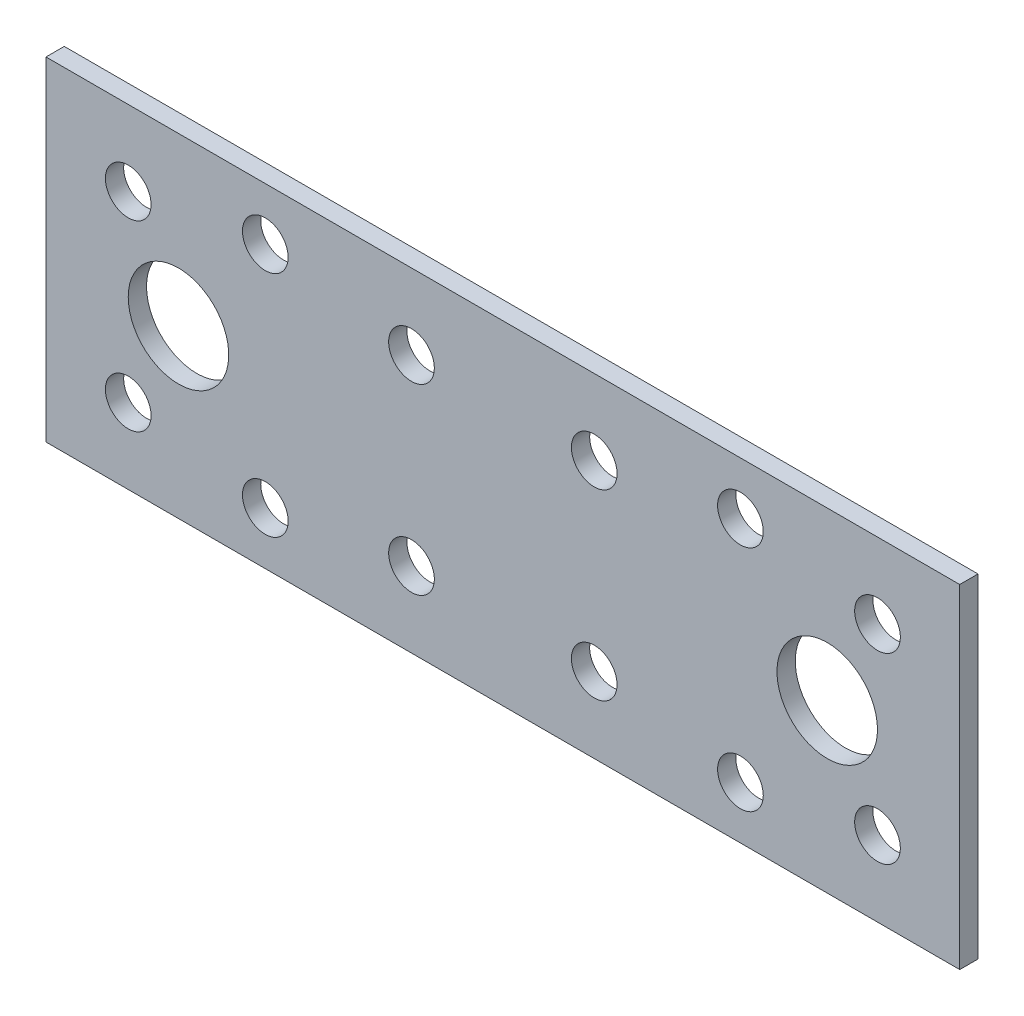
ISO-10303-21;
HEADER;
FILE_DESCRIPTION(('STEP AP214'),'2;1');
FILE_NAME('part.step','',(''),(''),'','','');
FILE_SCHEMA(('AUTOMOTIVE_DESIGN { 1 0 10303 214 1 1 1 1 }'));
ENDSEC;
DATA;
#1=APPLICATION_CONTEXT('core data for automotive mechanical design processes');
#2=APPLICATION_PROTOCOL_DEFINITION('international standard','automotive_design',2000,#1);
#3=PRODUCT_CONTEXT('',#1,'mechanical');
#4=PRODUCT('Part','Part','',(#3));
#5=PRODUCT_RELATED_PRODUCT_CATEGORY('part','',(#4));
#6=PRODUCT_DEFINITION_FORMATION('','',#4);
#7=PRODUCT_DEFINITION_CONTEXT('part definition',#1,'design');
#8=PRODUCT_DEFINITION('design','',#6,#7);
#9=PRODUCT_DEFINITION_SHAPE('','',#8);
#10=(LENGTH_UNIT() NAMED_UNIT(*) SI_UNIT(.MILLI.,.METRE.));
#11=(NAMED_UNIT(*) PLANE_ANGLE_UNIT() SI_UNIT($,.RADIAN.));
#12=(NAMED_UNIT(*) SI_UNIT($,.STERADIAN.) SOLID_ANGLE_UNIT());
#13=UNCERTAINTY_MEASURE_WITH_UNIT(LENGTH_MEASURE(1.E-05),#10,'distance_accuracy_value','');
#14=(GEOMETRIC_REPRESENTATION_CONTEXT(3) GLOBAL_UNCERTAINTY_ASSIGNED_CONTEXT((#13)) GLOBAL_UNIT_ASSIGNED_CONTEXT((#10,
#11,#12)) REPRESENTATION_CONTEXT('',''));
#15=CARTESIAN_POINT('',(0.,0.,0.));
#16=DIRECTION('',(0.,0.,1.));
#17=DIRECTION('',(1.,0.,0.));
#18=AXIS2_PLACEMENT_3D('',#15,#16,#17);
#19=CARTESIAN_POINT('',(-50.,18.25,2.));
#20=DIRECTION('',(0.,0.,-1.));
#21=DIRECTION('',(-1.,0.,0.));
#22=AXIS2_PLACEMENT_3D('',#19,#20,#21);
#23=PLANE('',#22);
#24=CARTESIAN_POINT('',(41.,10.,2.));
#25=DIRECTION('',(0.,0.,1.));
#26=DIRECTION('',(-1.,0.,0.));
#27=AXIS2_PLACEMENT_3D('',#24,#25,#26);
#28=CIRCLE('',#27,2.5);
#29=CARTESIAN_POINT('',(38.5,10.,2.));
#30=VERTEX_POINT('',#29);
#31=EDGE_CURVE('E181',#30,#30,#28,.T.);
#32=ORIENTED_EDGE('',*,*,#31,.F.);
#33=EDGE_LOOP('',(#32));
#34=FACE_BOUND('',#33,.T.);
#35=CARTESIAN_POINT('',(26.,-12.5,2.));
#36=DIRECTION('',(0.,0.,1.));
#37=DIRECTION('',(1.,0.,0.));
#38=AXIS2_PLACEMENT_3D('',#35,#36,#37);
#39=CIRCLE('',#38,2.5);
#40=CARTESIAN_POINT('',(28.5,-12.5,2.));
#41=VERTEX_POINT('',#40);
#42=EDGE_CURVE('E169',#41,#41,#39,.T.);
#43=ORIENTED_EDGE('',*,*,#42,.F.);
#44=EDGE_LOOP('',(#43));
#45=FACE_BOUND('',#44,.T.);
#46=CARTESIAN_POINT('',(10.,10.,2.));
#47=DIRECTION('',(0.,0.,1.));
#48=DIRECTION('',(-1.,0.,0.));
#49=AXIS2_PLACEMENT_3D('',#46,#47,#48);
#50=CIRCLE('',#49,2.5);
#51=CARTESIAN_POINT('',(7.5,10.,2.));
#52=VERTEX_POINT('',#51);
#53=EDGE_CURVE('E157',#52,#52,#50,.T.);
#54=ORIENTED_EDGE('',*,*,#53,.F.);
#55=EDGE_LOOP('',(#54));
#56=FACE_BOUND('',#55,.T.);
#57=CARTESIAN_POINT('',(-26.,-12.5,2.));
#58=DIRECTION('',(0.,0.,1.));
#59=DIRECTION('',(-1.,0.,0.));
#60=AXIS2_PLACEMENT_3D('',#57,#58,#59);
#61=CIRCLE('',#60,2.5);
#62=CARTESIAN_POINT('',(-28.5,-12.5,2.));
#63=VERTEX_POINT('',#62);
#64=EDGE_CURVE('E145',#63,#63,#61,.T.);
#65=ORIENTED_EDGE('',*,*,#64,.F.);
#66=EDGE_LOOP('',(#65));
#67=FACE_BOUND('',#66,.T.);
#68=CARTESIAN_POINT('',(-10.,10.,2.));
#69=DIRECTION('',(0.,0.,1.));
#70=DIRECTION('',(1.,0.,0.));
#71=AXIS2_PLACEMENT_3D('',#68,#69,#70);
#72=CIRCLE('',#71,2.5);
#73=CARTESIAN_POINT('',(-7.5,10.,2.));
#74=VERTEX_POINT('',#73);
#75=EDGE_CURVE('E133',#74,#74,#72,.T.);
#76=ORIENTED_EDGE('',*,*,#75,.F.);
#77=EDGE_LOOP('',(#76));
#78=FACE_BOUND('',#77,.T.);
#79=CARTESIAN_POINT('',(-41.,10.,2.));
#80=DIRECTION('',(0.,0.,1.));
#81=DIRECTION('',(1.,0.,0.));
#82=AXIS2_PLACEMENT_3D('',#79,#80,#81);
#83=CIRCLE('',#82,2.5);
#84=CARTESIAN_POINT('',(-38.5,10.,2.));
#85=VERTEX_POINT('',#84);
#86=EDGE_CURVE('E121',#85,#85,#83,.T.);
#87=ORIENTED_EDGE('',*,*,#86,.F.);
#88=EDGE_LOOP('',(#87));
#89=FACE_BOUND('',#88,.T.);
#90=CARTESIAN_POINT('',(35.5,0.,2.));
#91=DIRECTION('',(0.,0.,1.));
#92=DIRECTION('',(1.,0.,0.));
#93=AXIS2_PLACEMENT_3D('',#90,#91,#92);
#94=CIRCLE('',#93,5.5);
#95=CARTESIAN_POINT('',(41.,0.,2.));
#96=VERTEX_POINT('',#95);
#97=EDGE_CURVE('E100',#96,#96,#94,.T.);
#98=ORIENTED_EDGE('',*,*,#97,.F.);
#99=EDGE_LOOP('',(#98));
#100=FACE_BOUND('',#99,.T.);
#101=DIRECTION('',(0.,-1.,0.));
#102=VECTOR('',#101,1.);
#103=CARTESIAN_POINT('',(-50.,-18.25,2.));
#104=LINE('',#103,#102);
#105=CARTESIAN_POINT('',(-50.,18.25,2.));
#106=VERTEX_POINT('',#105);
#107=CARTESIAN_POINT('',(-50.,-18.25,2.));
#108=VERTEX_POINT('',#107);
#109=EDGE_CURVE('E85',#106,#108,#104,.T.);
#110=ORIENTED_EDGE('',*,*,#109,.T.);
#111=DIRECTION('',(1.,0.,0.));
#112=VECTOR('',#111,1.);
#113=CARTESIAN_POINT('',(-50.,-18.25,2.));
#114=LINE('',#113,#112);
#115=CARTESIAN_POINT('',(50.,-18.25,2.));
#116=VERTEX_POINT('',#115);
#117=EDGE_CURVE('E80',#108,#116,#114,.T.);
#118=ORIENTED_EDGE('',*,*,#117,.T.);
#119=DIRECTION('',(0.,1.,0.));
#120=VECTOR('',#119,1.);
#121=CARTESIAN_POINT('',(50.,-18.25,2.));
#122=LINE('',#121,#120);
#123=CARTESIAN_POINT('',(50.,18.25,2.));
#124=VERTEX_POINT('',#123);
#125=EDGE_CURVE('E83',#116,#124,#122,.T.);
#126=ORIENTED_EDGE('',*,*,#125,.T.);
#127=DIRECTION('',(-1.,0.,0.));
#128=VECTOR('',#127,1.);
#129=CARTESIAN_POINT('',(-50.,18.25,2.));
#130=LINE('',#129,#128);
#131=EDGE_CURVE('E50',#124,#106,#130,.T.);
#132=ORIENTED_EDGE('',*,*,#131,.T.);
#133=EDGE_LOOP('',(#110,#118,#126,#132));
#134=FACE_BOUND('',#133,.T.);
#135=CARTESIAN_POINT('',(-35.5,0.,2.));
#136=DIRECTION('',(0.,0.,1.));
#137=DIRECTION('',(-1.,0.,0.));
#138=AXIS2_PLACEMENT_3D('',#135,#136,#137);
#139=CIRCLE('',#138,5.5);
#140=CARTESIAN_POINT('',(-41.,0.,2.));
#141=VERTEX_POINT('',#140);
#142=EDGE_CURVE('E115',#141,#141,#139,.T.);
#143=ORIENTED_EDGE('',*,*,#142,.F.);
#144=EDGE_LOOP('',(#143));
#145=FACE_BOUND('',#144,.T.);
#146=CARTESIAN_POINT('',(-26.,12.5,2.));
#147=DIRECTION('',(0.,0.,1.));
#148=DIRECTION('',(1.,0.,0.));
#149=AXIS2_PLACEMENT_3D('',#146,#147,#148);
#150=CIRCLE('',#149,2.5);
#151=CARTESIAN_POINT('',(-23.5,12.5,2.));
#152=VERTEX_POINT('',#151);
#153=EDGE_CURVE('E127',#152,#152,#150,.T.);
#154=ORIENTED_EDGE('',*,*,#153,.F.);
#155=EDGE_LOOP('',(#154));
#156=FACE_BOUND('',#155,.T.);
#157=CARTESIAN_POINT('',(-10.,-10.,2.));
#158=DIRECTION('',(0.,0.,1.));
#159=DIRECTION('',(-1.,0.,0.));
#160=AXIS2_PLACEMENT_3D('',#157,#158,#159);
#161=CIRCLE('',#160,2.5);
#162=CARTESIAN_POINT('',(-12.5,-10.,2.));
#163=VERTEX_POINT('',#162);
#164=EDGE_CURVE('E139',#163,#163,#161,.T.);
#165=ORIENTED_EDGE('',*,*,#164,.F.);
#166=EDGE_LOOP('',(#165));
#167=FACE_BOUND('',#166,.T.);
#168=CARTESIAN_POINT('',(-41.,-10.,2.));
#169=DIRECTION('',(0.,0.,1.));
#170=DIRECTION('',(-1.,0.,0.));
#171=AXIS2_PLACEMENT_3D('',#168,#169,#170);
#172=CIRCLE('',#171,2.5);
#173=CARTESIAN_POINT('',(-43.5,-10.,2.));
#174=VERTEX_POINT('',#173);
#175=EDGE_CURVE('E151',#174,#174,#172,.T.);
#176=ORIENTED_EDGE('',*,*,#175,.F.);
#177=EDGE_LOOP('',(#176));
#178=FACE_BOUND('',#177,.T.);
#179=CARTESIAN_POINT('',(10.,-10.,2.));
#180=DIRECTION('',(0.,0.,1.));
#181=DIRECTION('',(1.,0.,0.));
#182=AXIS2_PLACEMENT_3D('',#179,#180,#181);
#183=CIRCLE('',#182,2.5);
#184=CARTESIAN_POINT('',(12.5,-10.,2.));
#185=VERTEX_POINT('',#184);
#186=EDGE_CURVE('E163',#185,#185,#183,.T.);
#187=ORIENTED_EDGE('',*,*,#186,.F.);
#188=EDGE_LOOP('',(#187));
#189=FACE_BOUND('',#188,.T.);
#190=CARTESIAN_POINT('',(26.,12.5,2.));
#191=DIRECTION('',(0.,0.,1.));
#192=DIRECTION('',(-1.,0.,0.));
#193=AXIS2_PLACEMENT_3D('',#190,#191,#192);
#194=CIRCLE('',#193,2.5);
#195=CARTESIAN_POINT('',(23.5,12.5,2.));
#196=VERTEX_POINT('',#195);
#197=EDGE_CURVE('E175',#196,#196,#194,.T.);
#198=ORIENTED_EDGE('',*,*,#197,.F.);
#199=EDGE_LOOP('',(#198));
#200=FACE_BOUND('',#199,.T.);
#201=CARTESIAN_POINT('',(41.,-10.,2.));
#202=DIRECTION('',(0.,0.,1.));
#203=DIRECTION('',(1.,0.,0.));
#204=AXIS2_PLACEMENT_3D('',#201,#202,#203);
#205=CIRCLE('',#204,2.5);
#206=CARTESIAN_POINT('',(43.5,-10.,2.));
#207=VERTEX_POINT('',#206);
#208=EDGE_CURVE('E187',#207,#207,#205,.T.);
#209=ORIENTED_EDGE('',*,*,#208,.F.);
#210=EDGE_LOOP('',(#209));
#211=FACE_BOUND('',#210,.T.);
#212=ADVANCED_FACE('F33',(#34,#45,#56,#67,#78,#89,#100,#134,#145,#156,#167,#178,#189,#200,#211),
#23,.F.);
#213=CARTESIAN_POINT('',(-50.,18.25,0.));
#214=DIRECTION('',(0.,0.,-1.));
#215=DIRECTION('',(-1.,0.,0.));
#216=AXIS2_PLACEMENT_3D('',#213,#214,#215);
#217=PLANE('',#216);
#218=CARTESIAN_POINT('',(41.,10.,0.));
#219=DIRECTION('',(0.,0.,1.));
#220=DIRECTION('',(-1.,0.,0.));
#221=AXIS2_PLACEMENT_3D('',#218,#219,#220);
#222=CIRCLE('',#221,2.5);
#223=CARTESIAN_POINT('',(38.5,10.,0.));
#224=VERTEX_POINT('',#223);
#225=EDGE_CURVE('E184',#224,#224,#222,.T.);
#226=ORIENTED_EDGE('',*,*,#225,.T.);
#227=EDGE_LOOP('',(#226));
#228=FACE_BOUND('',#227,.T.);
#229=CARTESIAN_POINT('',(26.,-12.5,0.));
#230=DIRECTION('',(0.,0.,1.));
#231=DIRECTION('',(1.,0.,0.));
#232=AXIS2_PLACEMENT_3D('',#229,#230,#231);
#233=CIRCLE('',#232,2.5);
#234=CARTESIAN_POINT('',(28.5,-12.5,0.));
#235=VERTEX_POINT('',#234);
#236=EDGE_CURVE('E172',#235,#235,#233,.T.);
#237=ORIENTED_EDGE('',*,*,#236,.T.);
#238=EDGE_LOOP('',(#237));
#239=FACE_BOUND('',#238,.T.);
#240=CARTESIAN_POINT('',(10.,10.,0.));
#241=DIRECTION('',(0.,0.,1.));
#242=DIRECTION('',(-1.,0.,0.));
#243=AXIS2_PLACEMENT_3D('',#240,#241,#242);
#244=CIRCLE('',#243,2.5);
#245=CARTESIAN_POINT('',(7.5,10.,0.));
#246=VERTEX_POINT('',#245);
#247=EDGE_CURVE('E160',#246,#246,#244,.T.);
#248=ORIENTED_EDGE('',*,*,#247,.T.);
#249=EDGE_LOOP('',(#248));
#250=FACE_BOUND('',#249,.T.);
#251=CARTESIAN_POINT('',(-26.,-12.5,0.));
#252=DIRECTION('',(0.,0.,1.));
#253=DIRECTION('',(-1.,0.,0.));
#254=AXIS2_PLACEMENT_3D('',#251,#252,#253);
#255=CIRCLE('',#254,2.5);
#256=CARTESIAN_POINT('',(-28.5,-12.5,0.));
#257=VERTEX_POINT('',#256);
#258=EDGE_CURVE('E148',#257,#257,#255,.T.);
#259=ORIENTED_EDGE('',*,*,#258,.T.);
#260=EDGE_LOOP('',(#259));
#261=FACE_BOUND('',#260,.T.);
#262=CARTESIAN_POINT('',(-10.,10.,0.));
#263=DIRECTION('',(0.,0.,1.));
#264=DIRECTION('',(1.,0.,0.));
#265=AXIS2_PLACEMENT_3D('',#262,#263,#264);
#266=CIRCLE('',#265,2.5);
#267=CARTESIAN_POINT('',(-7.5,10.,0.));
#268=VERTEX_POINT('',#267);
#269=EDGE_CURVE('E136',#268,#268,#266,.T.);
#270=ORIENTED_EDGE('',*,*,#269,.T.);
#271=EDGE_LOOP('',(#270));
#272=FACE_BOUND('',#271,.T.);
#273=CARTESIAN_POINT('',(-41.,10.,0.));
#274=DIRECTION('',(0.,0.,1.));
#275=DIRECTION('',(1.,0.,0.));
#276=AXIS2_PLACEMENT_3D('',#273,#274,#275);
#277=CIRCLE('',#276,2.5);
#278=CARTESIAN_POINT('',(-38.5,10.,0.));
#279=VERTEX_POINT('',#278);
#280=EDGE_CURVE('E124',#279,#279,#277,.T.);
#281=ORIENTED_EDGE('',*,*,#280,.T.);
#282=EDGE_LOOP('',(#281));
#283=FACE_BOUND('',#282,.T.);
#284=CARTESIAN_POINT('',(35.5,0.,0.));
#285=DIRECTION('',(0.,0.,1.));
#286=DIRECTION('',(1.,0.,0.));
#287=AXIS2_PLACEMENT_3D('',#284,#285,#286);
#288=CIRCLE('',#287,5.5);
#289=CARTESIAN_POINT('',(41.,0.,0.));
#290=VERTEX_POINT('',#289);
#291=EDGE_CURVE('E112',#290,#290,#288,.T.);
#292=ORIENTED_EDGE('',*,*,#291,.T.);
#293=EDGE_LOOP('',(#292));
#294=FACE_BOUND('',#293,.T.);
#295=DIRECTION('',(0.,-1.,0.));
#296=VECTOR('',#295,1.);
#297=CARTESIAN_POINT('',(-50.,-18.25,0.));
#298=LINE('',#297,#296);
#299=CARTESIAN_POINT('',(-50.,18.25,0.));
#300=VERTEX_POINT('',#299);
#301=CARTESIAN_POINT('',(-50.,-18.25,0.));
#302=VERTEX_POINT('',#301);
#303=EDGE_CURVE('E97',#300,#302,#298,.T.);
#304=ORIENTED_EDGE('',*,*,#303,.F.);
#305=DIRECTION('',(-1.,0.,0.));
#306=VECTOR('',#305,1.);
#307=CARTESIAN_POINT('',(-50.,18.25,0.));
#308=LINE('',#307,#306);
#309=CARTESIAN_POINT('',(50.,18.25,0.));
#310=VERTEX_POINT('',#309);
#311=EDGE_CURVE('E73',#310,#300,#308,.T.);
#312=ORIENTED_EDGE('',*,*,#311,.F.);
#313=DIRECTION('',(0.,1.,0.));
#314=VECTOR('',#313,1.);
#315=CARTESIAN_POINT('',(50.,-18.25,0.));
#316=LINE('',#315,#314);
#317=CARTESIAN_POINT('',(50.,-18.25,0.));
#318=VERTEX_POINT('',#317);
#319=EDGE_CURVE('E67',#318,#310,#316,.T.);
#320=ORIENTED_EDGE('',*,*,#319,.F.);
#321=DIRECTION('',(1.,0.,0.));
#322=VECTOR('',#321,1.);
#323=CARTESIAN_POINT('',(-50.,-18.25,0.));
#324=LINE('',#323,#322);
#325=EDGE_CURVE('E89',#302,#318,#324,.T.);
#326=ORIENTED_EDGE('',*,*,#325,.F.);
#327=EDGE_LOOP('',(#304,#312,#320,#326));
#328=FACE_BOUND('',#327,.T.);
#329=CARTESIAN_POINT('',(-35.5,0.,0.));
#330=DIRECTION('',(0.,0.,1.));
#331=DIRECTION('',(-1.,0.,0.));
#332=AXIS2_PLACEMENT_3D('',#329,#330,#331);
#333=CIRCLE('',#332,5.5);
#334=CARTESIAN_POINT('',(-41.,0.,0.));
#335=VERTEX_POINT('',#334);
#336=EDGE_CURVE('E118',#335,#335,#333,.T.);
#337=ORIENTED_EDGE('',*,*,#336,.T.);
#338=EDGE_LOOP('',(#337));
#339=FACE_BOUND('',#338,.T.);
#340=CARTESIAN_POINT('',(-26.,12.5,0.));
#341=DIRECTION('',(0.,0.,1.));
#342=DIRECTION('',(1.,0.,0.));
#343=AXIS2_PLACEMENT_3D('',#340,#341,#342);
#344=CIRCLE('',#343,2.5);
#345=CARTESIAN_POINT('',(-23.5,12.5,0.));
#346=VERTEX_POINT('',#345);
#347=EDGE_CURVE('E130',#346,#346,#344,.T.);
#348=ORIENTED_EDGE('',*,*,#347,.T.);
#349=EDGE_LOOP('',(#348));
#350=FACE_BOUND('',#349,.T.);
#351=CARTESIAN_POINT('',(-10.,-10.,0.));
#352=DIRECTION('',(0.,0.,1.));
#353=DIRECTION('',(-1.,0.,0.));
#354=AXIS2_PLACEMENT_3D('',#351,#352,#353);
#355=CIRCLE('',#354,2.5);
#356=CARTESIAN_POINT('',(-12.5,-10.,0.));
#357=VERTEX_POINT('',#356);
#358=EDGE_CURVE('E142',#357,#357,#355,.T.);
#359=ORIENTED_EDGE('',*,*,#358,.T.);
#360=EDGE_LOOP('',(#359));
#361=FACE_BOUND('',#360,.T.);
#362=CARTESIAN_POINT('',(-41.,-10.,0.));
#363=DIRECTION('',(0.,0.,1.));
#364=DIRECTION('',(-1.,0.,0.));
#365=AXIS2_PLACEMENT_3D('',#362,#363,#364);
#366=CIRCLE('',#365,2.5);
#367=CARTESIAN_POINT('',(-43.5,-10.,0.));
#368=VERTEX_POINT('',#367);
#369=EDGE_CURVE('E154',#368,#368,#366,.T.);
#370=ORIENTED_EDGE('',*,*,#369,.T.);
#371=EDGE_LOOP('',(#370));
#372=FACE_BOUND('',#371,.T.);
#373=CARTESIAN_POINT('',(10.,-10.,0.));
#374=DIRECTION('',(0.,0.,1.));
#375=DIRECTION('',(1.,0.,0.));
#376=AXIS2_PLACEMENT_3D('',#373,#374,#375);
#377=CIRCLE('',#376,2.5);
#378=CARTESIAN_POINT('',(12.5,-10.,0.));
#379=VERTEX_POINT('',#378);
#380=EDGE_CURVE('E166',#379,#379,#377,.T.);
#381=ORIENTED_EDGE('',*,*,#380,.T.);
#382=EDGE_LOOP('',(#381));
#383=FACE_BOUND('',#382,.T.);
#384=CARTESIAN_POINT('',(26.,12.5,0.));
#385=DIRECTION('',(0.,0.,1.));
#386=DIRECTION('',(-1.,0.,0.));
#387=AXIS2_PLACEMENT_3D('',#384,#385,#386);
#388=CIRCLE('',#387,2.5);
#389=CARTESIAN_POINT('',(23.5,12.5,0.));
#390=VERTEX_POINT('',#389);
#391=EDGE_CURVE('E178',#390,#390,#388,.T.);
#392=ORIENTED_EDGE('',*,*,#391,.T.);
#393=EDGE_LOOP('',(#392));
#394=FACE_BOUND('',#393,.T.);
#395=CARTESIAN_POINT('',(41.,-10.,0.));
#396=DIRECTION('',(0.,0.,1.));
#397=DIRECTION('',(1.,0.,0.));
#398=AXIS2_PLACEMENT_3D('',#395,#396,#397);
#399=CIRCLE('',#398,2.5);
#400=CARTESIAN_POINT('',(43.5,-10.,0.));
#401=VERTEX_POINT('',#400);
#402=EDGE_CURVE('E190',#401,#401,#399,.T.);
#403=ORIENTED_EDGE('',*,*,#402,.T.);
#404=EDGE_LOOP('',(#403));
#405=FACE_BOUND('',#404,.T.);
#406=ADVANCED_FACE('F108',(#228,#239,#250,#261,#272,#283,#294,#328,#339,#350,#361,#372,#383,
#394,#405),#217,.T.);
#407=CARTESIAN_POINT('',(-50.,-18.25,2.));
#408=DIRECTION('',(1.,0.,0.));
#409=DIRECTION('',(0.,0.,-1.));
#410=AXIS2_PLACEMENT_3D('',#407,#408,#409);
#411=PLANE('',#410);
#412=ORIENTED_EDGE('',*,*,#303,.T.);
#413=DIRECTION('',(0.,0.,-1.));
#414=VECTOR('',#413,1.);
#415=CARTESIAN_POINT('',(-50.,-18.25,2.));
#416=LINE('',#415,#414);
#417=EDGE_CURVE('E11',#108,#302,#416,.T.);
#418=ORIENTED_EDGE('',*,*,#417,.F.);
#419=ORIENTED_EDGE('',*,*,#109,.F.);
#420=DIRECTION('',(0.,0.,-1.));
#421=VECTOR('',#420,1.);
#422=CARTESIAN_POINT('',(-50.,18.25,2.));
#423=LINE('',#422,#421);
#424=EDGE_CURVE('E93',#106,#300,#423,.T.);
#425=ORIENTED_EDGE('',*,*,#424,.T.);
#426=EDGE_LOOP('',(#412,#418,#419,#425));
#427=FACE_BOUND('',#426,.T.);
#428=ADVANCED_FACE('F35',(#427),#411,.F.);
#429=CARTESIAN_POINT('',(-50.,-18.25,2.));
#430=DIRECTION('',(0.,1.,0.));
#431=DIRECTION('',(0.,0.,1.));
#432=AXIS2_PLACEMENT_3D('',#429,#430,#431);
#433=PLANE('',#432);
#434=ORIENTED_EDGE('',*,*,#325,.T.);
#435=DIRECTION('',(0.,0.,-1.));
#436=VECTOR('',#435,1.);
#437=CARTESIAN_POINT('',(50.,-18.25,2.));
#438=LINE('',#437,#436);
#439=EDGE_CURVE('E42',#116,#318,#438,.T.);
#440=ORIENTED_EDGE('',*,*,#439,.F.);
#441=ORIENTED_EDGE('',*,*,#117,.F.);
#442=ORIENTED_EDGE('',*,*,#417,.T.);
#443=EDGE_LOOP('',(#434,#440,#441,#442));
#444=FACE_BOUND('',#443,.T.);
#445=ADVANCED_FACE('F88',(#444),#433,.F.);
#446=CARTESIAN_POINT('',(50.,-18.25,2.));
#447=DIRECTION('',(-1.,0.,0.));
#448=DIRECTION('',(0.,0.,1.));
#449=AXIS2_PLACEMENT_3D('',#446,#447,#448);
#450=PLANE('',#449);
#451=ORIENTED_EDGE('',*,*,#319,.T.);
#452=DIRECTION('',(0.,0.,-1.));
#453=VECTOR('',#452,1.);
#454=CARTESIAN_POINT('',(50.,18.25,2.));
#455=LINE('',#454,#453);
#456=EDGE_CURVE('E90',#124,#310,#455,.T.);
#457=ORIENTED_EDGE('',*,*,#456,.F.);
#458=ORIENTED_EDGE('',*,*,#125,.F.);
#459=ORIENTED_EDGE('',*,*,#439,.T.);
#460=EDGE_LOOP('',(#451,#457,#458,#459));
#461=FACE_BOUND('',#460,.T.);
#462=ADVANCED_FACE('F91',(#461),#450,.F.);
#463=CARTESIAN_POINT('',(-50.,18.25,2.));
#464=DIRECTION('',(0.,-1.,0.));
#465=DIRECTION('',(0.,0.,-1.));
#466=AXIS2_PLACEMENT_3D('',#463,#464,#465);
#467=PLANE('',#466);
#468=ORIENTED_EDGE('',*,*,#311,.T.);
#469=ORIENTED_EDGE('',*,*,#424,.F.);
#470=ORIENTED_EDGE('',*,*,#131,.F.);
#471=ORIENTED_EDGE('',*,*,#456,.T.);
#472=EDGE_LOOP('',(#468,#469,#470,#471));
#473=FACE_BOUND('',#472,.T.);
#474=ADVANCED_FACE('F105',(#473),#467,.F.);
#475=CARTESIAN_POINT('',(35.5,0.,2.));
#476=DIRECTION('',(0.,0.,-1.));
#477=DIRECTION('',(-1.,0.,0.));
#478=AXIS2_PLACEMENT_3D('',#475,#476,#477);
#479=CYLINDRICAL_SURFACE('',#478,5.5);
#480=ORIENTED_EDGE('',*,*,#97,.T.);
#481=EDGE_LOOP('',(#480));
#482=FACE_BOUND('',#481,.T.);
#483=ORIENTED_EDGE('',*,*,#291,.F.);
#484=EDGE_LOOP('',(#483));
#485=FACE_BOUND('',#484,.T.);
#486=ADVANCED_FACE('F210',(#482,#485),#479,.F.);
#487=CARTESIAN_POINT('',(-35.5,0.,2.));
#488=DIRECTION('',(0.,0.,-1.));
#489=DIRECTION('',(-1.,0.,0.));
#490=AXIS2_PLACEMENT_3D('',#487,#488,#489);
#491=CYLINDRICAL_SURFACE('',#490,5.5);
#492=ORIENTED_EDGE('',*,*,#142,.T.);
#493=EDGE_LOOP('',(#492));
#494=FACE_BOUND('',#493,.T.);
#495=ORIENTED_EDGE('',*,*,#336,.F.);
#496=EDGE_LOOP('',(#495));
#497=FACE_BOUND('',#496,.T.);
#498=ADVANCED_FACE('F256',(#494,#497),#491,.F.);
#499=CARTESIAN_POINT('',(-41.,10.,2.));
#500=DIRECTION('',(0.,0.,-1.));
#501=DIRECTION('',(-1.,0.,0.));
#502=AXIS2_PLACEMENT_3D('',#499,#500,#501);
#503=CYLINDRICAL_SURFACE('',#502,2.5);
#504=ORIENTED_EDGE('',*,*,#86,.T.);
#505=EDGE_LOOP('',(#504));
#506=FACE_BOUND('',#505,.T.);
#507=ORIENTED_EDGE('',*,*,#280,.F.);
#508=EDGE_LOOP('',(#507));
#509=FACE_BOUND('',#508,.T.);
#510=ADVANCED_FACE('F264',(#506,#509),#503,.F.);
#511=CARTESIAN_POINT('',(-26.,12.5,2.));
#512=DIRECTION('',(0.,0.,-1.));
#513=DIRECTION('',(-1.,0.,0.));
#514=AXIS2_PLACEMENT_3D('',#511,#512,#513);
#515=CYLINDRICAL_SURFACE('',#514,2.5);
#516=ORIENTED_EDGE('',*,*,#153,.T.);
#517=EDGE_LOOP('',(#516));
#518=FACE_BOUND('',#517,.T.);
#519=ORIENTED_EDGE('',*,*,#347,.F.);
#520=EDGE_LOOP('',(#519));
#521=FACE_BOUND('',#520,.T.);
#522=ADVANCED_FACE('F272',(#518,#521),#515,.F.);
#523=CARTESIAN_POINT('',(-10.,10.,2.));
#524=DIRECTION('',(0.,0.,-1.));
#525=DIRECTION('',(-1.,0.,0.));
#526=AXIS2_PLACEMENT_3D('',#523,#524,#525);
#527=CYLINDRICAL_SURFACE('',#526,2.5);
#528=ORIENTED_EDGE('',*,*,#75,.T.);
#529=EDGE_LOOP('',(#528));
#530=FACE_BOUND('',#529,.T.);
#531=ORIENTED_EDGE('',*,*,#269,.F.);
#532=EDGE_LOOP('',(#531));
#533=FACE_BOUND('',#532,.T.);
#534=ADVANCED_FACE('F281',(#530,#533),#527,.F.);
#535=CARTESIAN_POINT('',(-10.,-10.,2.));
#536=DIRECTION('',(0.,0.,-1.));
#537=DIRECTION('',(-1.,0.,0.));
#538=AXIS2_PLACEMENT_3D('',#535,#536,#537);
#539=CYLINDRICAL_SURFACE('',#538,2.5);
#540=ORIENTED_EDGE('',*,*,#164,.T.);
#541=EDGE_LOOP('',(#540));
#542=FACE_BOUND('',#541,.T.);
#543=ORIENTED_EDGE('',*,*,#358,.F.);
#544=EDGE_LOOP('',(#543));
#545=FACE_BOUND('',#544,.T.);
#546=ADVANCED_FACE('F290',(#542,#545),#539,.F.);
#547=CARTESIAN_POINT('',(-26.,-12.5,2.));
#548=DIRECTION('',(0.,0.,-1.));
#549=DIRECTION('',(-1.,0.,0.));
#550=AXIS2_PLACEMENT_3D('',#547,#548,#549);
#551=CYLINDRICAL_SURFACE('',#550,2.5);
#552=ORIENTED_EDGE('',*,*,#64,.T.);
#553=EDGE_LOOP('',(#552));
#554=FACE_BOUND('',#553,.T.);
#555=ORIENTED_EDGE('',*,*,#258,.F.);
#556=EDGE_LOOP('',(#555));
#557=FACE_BOUND('',#556,.T.);
#558=ADVANCED_FACE('F299',(#554,#557),#551,.F.);
#559=CARTESIAN_POINT('',(-41.,-10.,2.));
#560=DIRECTION('',(0.,0.,-1.));
#561=DIRECTION('',(-1.,0.,0.));
#562=AXIS2_PLACEMENT_3D('',#559,#560,#561);
#563=CYLINDRICAL_SURFACE('',#562,2.5);
#564=ORIENTED_EDGE('',*,*,#175,.T.);
#565=EDGE_LOOP('',(#564));
#566=FACE_BOUND('',#565,.T.);
#567=ORIENTED_EDGE('',*,*,#369,.F.);
#568=EDGE_LOOP('',(#567));
#569=FACE_BOUND('',#568,.T.);
#570=ADVANCED_FACE('F308',(#566,#569),#563,.F.);
#571=CARTESIAN_POINT('',(10.,10.,2.));
#572=DIRECTION('',(0.,0.,-1.));
#573=DIRECTION('',(-1.,0.,0.));
#574=AXIS2_PLACEMENT_3D('',#571,#572,#573);
#575=CYLINDRICAL_SURFACE('',#574,2.5);
#576=ORIENTED_EDGE('',*,*,#53,.T.);
#577=EDGE_LOOP('',(#576));
#578=FACE_BOUND('',#577,.T.);
#579=ORIENTED_EDGE('',*,*,#247,.F.);
#580=EDGE_LOOP('',(#579));
#581=FACE_BOUND('',#580,.T.);
#582=ADVANCED_FACE('F317',(#578,#581),#575,.F.);
#583=CARTESIAN_POINT('',(10.,-10.,2.));
#584=DIRECTION('',(0.,0.,-1.));
#585=DIRECTION('',(-1.,0.,0.));
#586=AXIS2_PLACEMENT_3D('',#583,#584,#585);
#587=CYLINDRICAL_SURFACE('',#586,2.5);
#588=ORIENTED_EDGE('',*,*,#186,.T.);
#589=EDGE_LOOP('',(#588));
#590=FACE_BOUND('',#589,.T.);
#591=ORIENTED_EDGE('',*,*,#380,.F.);
#592=EDGE_LOOP('',(#591));
#593=FACE_BOUND('',#592,.T.);
#594=ADVANCED_FACE('F326',(#590,#593),#587,.F.);
#595=CARTESIAN_POINT('',(26.,-12.5,2.));
#596=DIRECTION('',(0.,0.,-1.));
#597=DIRECTION('',(-1.,0.,0.));
#598=AXIS2_PLACEMENT_3D('',#595,#596,#597);
#599=CYLINDRICAL_SURFACE('',#598,2.5);
#600=ORIENTED_EDGE('',*,*,#42,.T.);
#601=EDGE_LOOP('',(#600));
#602=FACE_BOUND('',#601,.T.);
#603=ORIENTED_EDGE('',*,*,#236,.F.);
#604=EDGE_LOOP('',(#603));
#605=FACE_BOUND('',#604,.T.);
#606=ADVANCED_FACE('F335',(#602,#605),#599,.F.);
#607=CARTESIAN_POINT('',(26.,12.5,2.));
#608=DIRECTION('',(0.,0.,-1.));
#609=DIRECTION('',(-1.,0.,0.));
#610=AXIS2_PLACEMENT_3D('',#607,#608,#609);
#611=CYLINDRICAL_SURFACE('',#610,2.5);
#612=ORIENTED_EDGE('',*,*,#197,.T.);
#613=EDGE_LOOP('',(#612));
#614=FACE_BOUND('',#613,.T.);
#615=ORIENTED_EDGE('',*,*,#391,.F.);
#616=EDGE_LOOP('',(#615));
#617=FACE_BOUND('',#616,.T.);
#618=ADVANCED_FACE('F344',(#614,#617),#611,.F.);
#619=CARTESIAN_POINT('',(41.,10.,2.));
#620=DIRECTION('',(0.,0.,-1.));
#621=DIRECTION('',(-1.,0.,0.));
#622=AXIS2_PLACEMENT_3D('',#619,#620,#621);
#623=CYLINDRICAL_SURFACE('',#622,2.5);
#624=ORIENTED_EDGE('',*,*,#31,.T.);
#625=EDGE_LOOP('',(#624));
#626=FACE_BOUND('',#625,.T.);
#627=ORIENTED_EDGE('',*,*,#225,.F.);
#628=EDGE_LOOP('',(#627));
#629=FACE_BOUND('',#628,.T.);
#630=ADVANCED_FACE('F353',(#626,#629),#623,.F.);
#631=CARTESIAN_POINT('',(41.,-10.,2.));
#632=DIRECTION('',(0.,0.,-1.));
#633=DIRECTION('',(-1.,0.,0.));
#634=AXIS2_PLACEMENT_3D('',#631,#632,#633);
#635=CYLINDRICAL_SURFACE('',#634,2.5);
#636=ORIENTED_EDGE('',*,*,#208,.T.);
#637=EDGE_LOOP('',(#636));
#638=FACE_BOUND('',#637,.T.);
#639=ORIENTED_EDGE('',*,*,#402,.F.);
#640=EDGE_LOOP('',(#639));
#641=FACE_BOUND('',#640,.T.);
#642=ADVANCED_FACE('F196',(#638,#641),#635,.F.);
#643=CLOSED_SHELL('',(#212,#406,#428,#445,#462,#474,#486,#498,#510,#522,#534,#546,#558,#570,
#582,#594,#606,#618,#630,#642));
#644=MANIFOLD_SOLID_BREP('B2',#643);
#645=ADVANCED_BREP_SHAPE_REPRESENTATION('',(#18,#644),#14);
#646=SHAPE_DEFINITION_REPRESENTATION(#9,#645);
ENDSEC;
END-ISO-10303-21;
